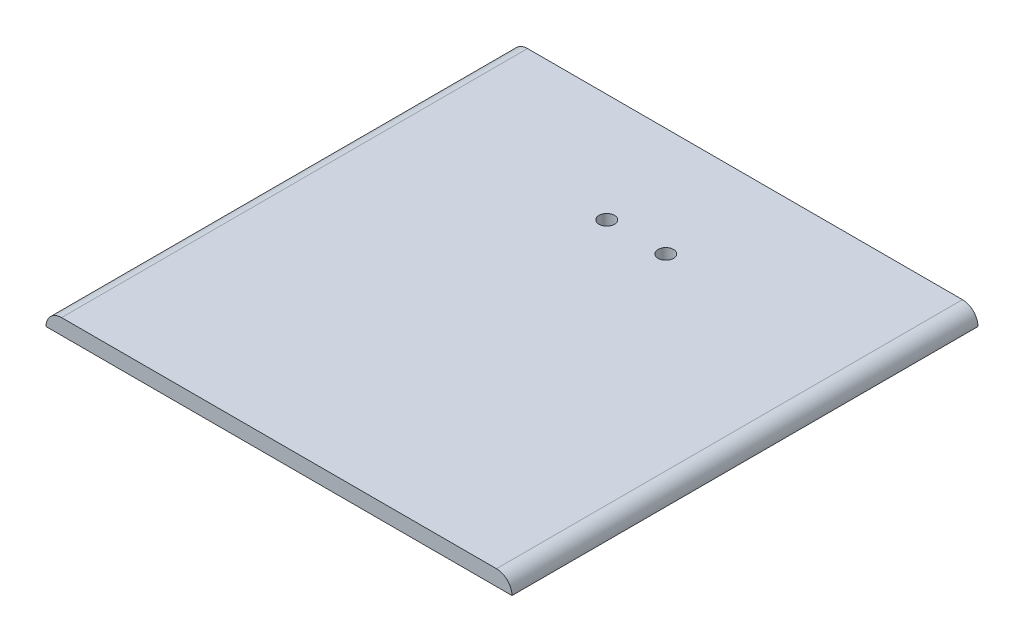
ISO-10303-21;
HEADER;
FILE_DESCRIPTION(('STEP AP214'),'2;1');
FILE_NAME('part.step','',(''),(''),'','','');
FILE_SCHEMA(('AUTOMOTIVE_DESIGN { 1 0 10303 214 1 1 1 1 }'));
ENDSEC;
DATA;
#1=APPLICATION_CONTEXT('core data for automotive mechanical design processes');
#2=APPLICATION_PROTOCOL_DEFINITION('international standard','automotive_design',2000,#1);
#3=PRODUCT_CONTEXT('',#1,'mechanical');
#4=PRODUCT('Part','Part','',(#3));
#5=PRODUCT_RELATED_PRODUCT_CATEGORY('part','',(#4));
#6=PRODUCT_DEFINITION_FORMATION('','',#4);
#7=PRODUCT_DEFINITION_CONTEXT('part definition',#1,'design');
#8=PRODUCT_DEFINITION('design','',#6,#7);
#9=PRODUCT_DEFINITION_SHAPE('','',#8);
#10=(LENGTH_UNIT() NAMED_UNIT(*) SI_UNIT(.MILLI.,.METRE.));
#11=(NAMED_UNIT(*) PLANE_ANGLE_UNIT() SI_UNIT($,.RADIAN.));
#12=(NAMED_UNIT(*) SI_UNIT($,.STERADIAN.) SOLID_ANGLE_UNIT());
#13=UNCERTAINTY_MEASURE_WITH_UNIT(LENGTH_MEASURE(1.E-05),#10,'distance_accuracy_value','');
#14=(GEOMETRIC_REPRESENTATION_CONTEXT(3) GLOBAL_UNCERTAINTY_ASSIGNED_CONTEXT((#13)) GLOBAL_UNIT_ASSIGNED_CONTEXT((#10,
#11,#12)) REPRESENTATION_CONTEXT('',''));
#15=CARTESIAN_POINT('',(0.,0.,0.));
#16=DIRECTION('',(0.,0.,1.));
#17=DIRECTION('',(1.,0.,0.));
#18=AXIS2_PLACEMENT_3D('',#15,#16,#17);
#19=CARTESIAN_POINT('',(-150.,10.,-150.));
#20=DIRECTION('',(0.,0.,1.));
#21=DIRECTION('',(1.,0.,0.));
#22=AXIS2_PLACEMENT_3D('',#19,#20,#21);
#23=PLANE('',#22);
#24=DIRECTION('',(-1.,0.,0.));
#25=VECTOR('',#24,1.);
#26=CARTESIAN_POINT('',(-150.,10.,-150.));
#27=LINE('',#26,#25);
#28=CARTESIAN_POINT('',(140.,10.,-150.));
#29=VERTEX_POINT('',#28);
#30=CARTESIAN_POINT('',(-140.,10.,-150.));
#31=VERTEX_POINT('',#30);
#32=EDGE_CURVE('E76',#29,#31,#27,.T.);
#33=ORIENTED_EDGE('',*,*,#32,.F.);
#34=CARTESIAN_POINT('',(140.,0.,-150.));
#35=DIRECTION('',(0.,0.,1.));
#36=DIRECTION('',(1.,0.,0.));
#37=AXIS2_PLACEMENT_3D('',#34,#35,#36);
#38=CIRCLE('',#37,10.);
#39=CARTESIAN_POINT('',(150.,0.,-150.));
#40=VERTEX_POINT('',#39);
#41=EDGE_CURVE('E41',#29,#40,#38,.F.);
#42=ORIENTED_EDGE('',*,*,#41,.T.);
#43=DIRECTION('',(-1.,0.,0.));
#44=VECTOR('',#43,1.);
#45=CARTESIAN_POINT('',(-150.,0.,-150.));
#46=LINE('',#45,#44);
#47=CARTESIAN_POINT('',(-150.,0.,-150.));
#48=VERTEX_POINT('',#47);
#49=EDGE_CURVE('E74',#40,#48,#46,.T.);
#50=ORIENTED_EDGE('',*,*,#49,.T.);
#51=CARTESIAN_POINT('',(-140.,0.,-150.));
#52=DIRECTION('',(0.,0.,1.));
#53=DIRECTION('',(1.,0.,0.));
#54=AXIS2_PLACEMENT_3D('',#51,#52,#53);
#55=CIRCLE('',#54,10.);
#56=EDGE_CURVE('E104',#48,#31,#55,.F.);
#57=ORIENTED_EDGE('',*,*,#56,.T.);
#58=EDGE_LOOP('',(#33,#42,#50,#57));
#59=FACE_BOUND('',#58,.T.);
#60=ADVANCED_FACE('F33',(#59),#23,.F.);
#61=CARTESIAN_POINT('',(-150.,10.,150.));
#62=DIRECTION('',(0.,0.,-1.));
#63=DIRECTION('',(-1.,0.,0.));
#64=AXIS2_PLACEMENT_3D('',#61,#62,#63);
#65=PLANE('',#64);
#66=DIRECTION('',(1.,0.,0.));
#67=VECTOR('',#66,1.);
#68=CARTESIAN_POINT('',(-150.,0.,150.));
#69=LINE('',#68,#67);
#70=CARTESIAN_POINT('',(-150.,0.,150.));
#71=VERTEX_POINT('',#70);
#72=CARTESIAN_POINT('',(150.,0.,150.));
#73=VERTEX_POINT('',#72);
#74=EDGE_CURVE('E97',#71,#73,#69,.T.);
#75=ORIENTED_EDGE('',*,*,#74,.T.);
#76=CARTESIAN_POINT('',(140.,0.,150.));
#77=DIRECTION('',(0.,0.,-1.));
#78=DIRECTION('',(-1.,0.,0.));
#79=AXIS2_PLACEMENT_3D('',#76,#77,#78);
#80=CIRCLE('',#79,10.);
#81=CARTESIAN_POINT('',(140.,10.,150.));
#82=VERTEX_POINT('',#81);
#83=EDGE_CURVE('E11',#73,#82,#80,.F.);
#84=ORIENTED_EDGE('',*,*,#83,.T.);
#85=DIRECTION('',(1.,0.,0.));
#86=VECTOR('',#85,1.);
#87=CARTESIAN_POINT('',(-150.,10.,150.));
#88=LINE('',#87,#86);
#89=CARTESIAN_POINT('',(-140.,10.,150.));
#90=VERTEX_POINT('',#89);
#91=EDGE_CURVE('E93',#90,#82,#88,.T.);
#92=ORIENTED_EDGE('',*,*,#91,.F.);
#93=CARTESIAN_POINT('',(-140.,0.,150.));
#94=DIRECTION('',(0.,0.,-1.));
#95=DIRECTION('',(-1.,0.,0.));
#96=AXIS2_PLACEMENT_3D('',#93,#94,#95);
#97=CIRCLE('',#96,10.);
#98=EDGE_CURVE('E102',#90,#71,#97,.F.);
#99=ORIENTED_EDGE('',*,*,#98,.T.);
#100=EDGE_LOOP('',(#75,#84,#92,#99));
#101=FACE_BOUND('',#100,.T.);
#102=ADVANCED_FACE('F123',(#101),#65,.F.);
#103=CARTESIAN_POINT('',(0.,10.,0.));
#104=DIRECTION('',(0.,1.,0.));
#105=DIRECTION('',(0.,0.,1.));
#106=AXIS2_PLACEMENT_3D('',#103,#104,#105);
#107=PLANE('',#106);
#108=CARTESIAN_POINT('',(-19.,10.,-80.));
#109=DIRECTION('',(0.,1.,0.));
#110=DIRECTION('',(0.,0.,1.));
#111=AXIS2_PLACEMENT_3D('',#108,#109,#110);
#112=CIRCLE('',#111,5.);
#113=CARTESIAN_POINT('',(-19.,10.,-75.));
#114=VERTEX_POINT('',#113);
#115=EDGE_CURVE('E90',#114,#114,#112,.T.);
#116=ORIENTED_EDGE('',*,*,#115,.F.);
#117=EDGE_LOOP('',(#116));
#118=FACE_BOUND('',#117,.T.);
#119=CARTESIAN_POINT('',(19.,10.,-80.));
#120=DIRECTION('',(0.,1.,0.));
#121=DIRECTION('',(0.,0.,1.));
#122=AXIS2_PLACEMENT_3D('',#119,#120,#121);
#123=CIRCLE('',#122,5.);
#124=CARTESIAN_POINT('',(19.,10.,-75.));
#125=VERTEX_POINT('',#124);
#126=EDGE_CURVE('E110',#125,#125,#123,.T.);
#127=ORIENTED_EDGE('',*,*,#126,.F.);
#128=EDGE_LOOP('',(#127));
#129=FACE_BOUND('',#128,.T.);
#130=ORIENTED_EDGE('',*,*,#91,.T.);
#131=DIRECTION('',(0.,0.,-1.));
#132=VECTOR('',#131,1.);
#133=CARTESIAN_POINT('',(140.,10.,-150.));
#134=LINE('',#133,#132);
#135=EDGE_CURVE('E77',#82,#29,#134,.T.);
#136=ORIENTED_EDGE('',*,*,#135,.T.);
#137=ORIENTED_EDGE('',*,*,#32,.T.);
#138=DIRECTION('',(0.,0.,1.));
#139=VECTOR('',#138,1.);
#140=CARTESIAN_POINT('',(-140.,10.,150.));
#141=LINE('',#140,#139);
#142=EDGE_CURVE('E99',#31,#90,#141,.T.);
#143=ORIENTED_EDGE('',*,*,#142,.T.);
#144=EDGE_LOOP('',(#130,#136,#137,#143));
#145=FACE_BOUND('',#144,.T.);
#146=ADVANCED_FACE('F107',(#118,#129,#145),#107,.T.);
#147=CARTESIAN_POINT('',(0.,0.,0.));
#148=DIRECTION('',(0.,1.,0.));
#149=DIRECTION('',(0.,0.,1.));
#150=AXIS2_PLACEMENT_3D('',#147,#148,#149);
#151=PLANE('',#150);
#152=CARTESIAN_POINT('',(-19.,0.,-80.));
#153=DIRECTION('',(0.,1.,0.));
#154=DIRECTION('',(0.,0.,1.));
#155=AXIS2_PLACEMENT_3D('',#152,#153,#154);
#156=CIRCLE('',#155,5.);
#157=CARTESIAN_POINT('',(-19.,0.,-75.));
#158=VERTEX_POINT('',#157);
#159=EDGE_CURVE('E87',#158,#158,#156,.T.);
#160=ORIENTED_EDGE('',*,*,#159,.T.);
#161=EDGE_LOOP('',(#160));
#162=FACE_BOUND('',#161,.T.);
#163=CARTESIAN_POINT('',(19.,0.,-80.));
#164=DIRECTION('',(0.,1.,0.));
#165=DIRECTION('',(0.,0.,1.));
#166=AXIS2_PLACEMENT_3D('',#163,#164,#165);
#167=CIRCLE('',#166,5.);
#168=CARTESIAN_POINT('',(19.,0.,-75.));
#169=VERTEX_POINT('',#168);
#170=EDGE_CURVE('E113',#169,#169,#167,.T.);
#171=ORIENTED_EDGE('',*,*,#170,.T.);
#172=EDGE_LOOP('',(#171));
#173=FACE_BOUND('',#172,.T.);
#174=DIRECTION('',(0.,0.,-1.));
#175=VECTOR('',#174,1.);
#176=CARTESIAN_POINT('',(150.,0.,-150.));
#177=LINE('',#176,#175);
#178=EDGE_CURVE('E82',#73,#40,#177,.T.);
#179=ORIENTED_EDGE('',*,*,#178,.F.);
#180=ORIENTED_EDGE('',*,*,#74,.F.);
#181=DIRECTION('',(0.,0.,1.));
#182=VECTOR('',#181,1.);
#183=CARTESIAN_POINT('',(-150.,0.,-150.));
#184=LINE('',#183,#182);
#185=EDGE_CURVE('E84',#48,#71,#184,.T.);
#186=ORIENTED_EDGE('',*,*,#185,.F.);
#187=ORIENTED_EDGE('',*,*,#49,.F.);
#188=EDGE_LOOP('',(#179,#180,#186,#187));
#189=FACE_BOUND('',#188,.T.);
#190=ADVANCED_FACE('F80',(#162,#173,#189),#151,.F.);
#191=CARTESIAN_POINT('',(19.,0.,-80.));
#192=DIRECTION('',(0.,1.,0.));
#193=DIRECTION('',(0.,0.,1.));
#194=AXIS2_PLACEMENT_3D('',#191,#192,#193);
#195=CYLINDRICAL_SURFACE('',#194,5.);
#196=ORIENTED_EDGE('',*,*,#170,.F.);
#197=EDGE_LOOP('',(#196));
#198=FACE_BOUND('',#197,.T.);
#199=ORIENTED_EDGE('',*,*,#126,.T.);
#200=EDGE_LOOP('',(#199));
#201=FACE_BOUND('',#200,.T.);
#202=ADVANCED_FACE('F127',(#198,#201),#195,.F.);
#203=CARTESIAN_POINT('',(-19.,0.,-80.));
#204=DIRECTION('',(0.,1.,0.));
#205=DIRECTION('',(0.,0.,1.));
#206=AXIS2_PLACEMENT_3D('',#203,#204,#205);
#207=CYLINDRICAL_SURFACE('',#206,5.);
#208=ORIENTED_EDGE('',*,*,#159,.F.);
#209=EDGE_LOOP('',(#208));
#210=FACE_BOUND('',#209,.T.);
#211=ORIENTED_EDGE('',*,*,#115,.T.);
#212=EDGE_LOOP('',(#211));
#213=FACE_BOUND('',#212,.T.);
#214=ADVANCED_FACE('F119',(#210,#213),#207,.F.);
#215=CARTESIAN_POINT('',(-140.,0.,0.));
#216=DIRECTION('',(0.,0.,-1.));
#217=DIRECTION('',(-1.,0.,0.));
#218=AXIS2_PLACEMENT_3D('',#215,#216,#217);
#219=CYLINDRICAL_SURFACE('',#218,10.);
#220=ORIENTED_EDGE('',*,*,#56,.F.);
#221=ORIENTED_EDGE('',*,*,#185,.T.);
#222=ORIENTED_EDGE('',*,*,#98,.F.);
#223=ORIENTED_EDGE('',*,*,#142,.F.);
#224=EDGE_LOOP('',(#220,#221,#222,#223));
#225=FACE_BOUND('',#224,.T.);
#226=ADVANCED_FACE('F135',(#225),#219,.T.);
#227=CARTESIAN_POINT('',(140.,0.,0.));
#228=DIRECTION('',(0.,0.,1.));
#229=DIRECTION('',(1.,0.,0.));
#230=AXIS2_PLACEMENT_3D('',#227,#228,#229);
#231=CYLINDRICAL_SURFACE('',#230,10.);
#232=ORIENTED_EDGE('',*,*,#83,.F.);
#233=ORIENTED_EDGE('',*,*,#178,.T.);
#234=ORIENTED_EDGE('',*,*,#41,.F.);
#235=ORIENTED_EDGE('',*,*,#135,.F.);
#236=EDGE_LOOP('',(#232,#233,#234,#235));
#237=FACE_BOUND('',#236,.T.);
#238=ADVANCED_FACE('F35',(#237),#231,.T.);
#239=CLOSED_SHELL('',(#60,#102,#146,#190,#202,#214,#226,#238));
#240=MANIFOLD_SOLID_BREP('B2',#239);
#241=ADVANCED_BREP_SHAPE_REPRESENTATION('',(#18,#240),#14);
#242=SHAPE_DEFINITION_REPRESENTATION(#9,#241);
ENDSEC;
END-ISO-10303-21;
